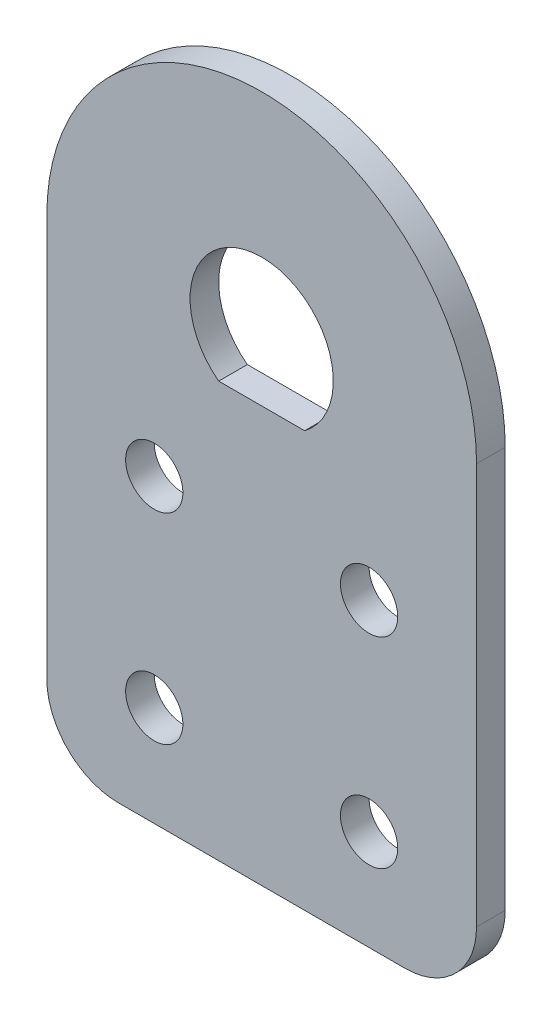
ISO-10303-21;
HEADER;
FILE_DESCRIPTION(('STEP AP214'),'2;1');
FILE_NAME('part.step','',(''),(''),'','','');
FILE_SCHEMA(('AUTOMOTIVE_DESIGN { 1 0 10303 214 1 1 1 1 }'));
ENDSEC;
DATA;
#1=APPLICATION_CONTEXT('core data for automotive mechanical design processes');
#2=APPLICATION_PROTOCOL_DEFINITION('international standard','automotive_design',2000,#1);
#3=PRODUCT_CONTEXT('',#1,'mechanical');
#4=PRODUCT('Part','Part','',(#3));
#5=PRODUCT_RELATED_PRODUCT_CATEGORY('part','',(#4));
#6=PRODUCT_DEFINITION_FORMATION('','',#4);
#7=PRODUCT_DEFINITION_CONTEXT('part definition',#1,'design');
#8=PRODUCT_DEFINITION('design','',#6,#7);
#9=PRODUCT_DEFINITION_SHAPE('','',#8);
#10=(LENGTH_UNIT() NAMED_UNIT(*) SI_UNIT(.MILLI.,.METRE.));
#11=(NAMED_UNIT(*) PLANE_ANGLE_UNIT() SI_UNIT($,.RADIAN.));
#12=(NAMED_UNIT(*) SI_UNIT($,.STERADIAN.) SOLID_ANGLE_UNIT());
#13=UNCERTAINTY_MEASURE_WITH_UNIT(LENGTH_MEASURE(1.E-05),#10,'distance_accuracy_value','');
#14=(GEOMETRIC_REPRESENTATION_CONTEXT(3) GLOBAL_UNCERTAINTY_ASSIGNED_CONTEXT((#13)) GLOBAL_UNIT_ASSIGNED_CONTEXT((#10,
#11,#12)) REPRESENTATION_CONTEXT('',''));
#15=CARTESIAN_POINT('',(0.,0.,0.));
#16=DIRECTION('',(0.,0.,1.));
#17=DIRECTION('',(1.,0.,0.));
#18=AXIS2_PLACEMENT_3D('',#15,#16,#17);
#19=CARTESIAN_POINT('',(0.,18.8034726819213,2.));
#20=DIRECTION('',(0.,0.,1.));
#21=DIRECTION('',(1.,0.,0.));
#22=AXIS2_PLACEMENT_3D('',#19,#20,#21);
#23=PLANE('',#22);
#24=CARTESIAN_POINT('',(7.5,-7.19652731807872,2.));
#25=DIRECTION('',(0.,0.,1.));
#26=DIRECTION('',(-1.,0.,0.));
#27=AXIS2_PLACEMENT_3D('',#24,#25,#26);
#28=CIRCLE('',#27,2.);
#29=CARTESIAN_POINT('',(5.5,-7.19652731807872,2.));
#30=VERTEX_POINT('',#29);
#31=EDGE_CURVE('E146',#30,#30,#28,.T.);
#32=ORIENTED_EDGE('',*,*,#31,.F.);
#33=EDGE_LOOP('',(#32));
#34=FACE_BOUND('',#33,.T.);
#35=CARTESIAN_POINT('',(-7.5,6.80347268192128,2.));
#36=DIRECTION('',(0.,0.,1.));
#37=DIRECTION('',(1.,0.,0.));
#38=AXIS2_PLACEMENT_3D('',#35,#36,#37);
#39=CIRCLE('',#38,2.);
#40=CARTESIAN_POINT('',(-5.5,6.80347268192128,2.));
#41=VERTEX_POINT('',#40);
#42=EDGE_CURVE('E162',#41,#41,#39,.T.);
#43=ORIENTED_EDGE('',*,*,#42,.F.);
#44=EDGE_LOOP('',(#43));
#45=FACE_BOUND('',#44,.T.);
#46=DIRECTION('',(1.,0.,0.));
#47=VECTOR('',#46,1.);
#48=CARTESIAN_POINT('',(15.,-14.1965273180787,2.));
#49=LINE('',#48,#47);
#50=CARTESIAN_POINT('',(-9.99999999999999,-14.1965273180787,2.));
#51=VERTEX_POINT('',#50);
#52=CARTESIAN_POINT('',(10.,-14.1965273180787,2.));
#53=VERTEX_POINT('',#52);
#54=EDGE_CURVE('E178',#51,#53,#49,.T.);
#55=ORIENTED_EDGE('',*,*,#54,.T.);
#56=CARTESIAN_POINT('',(10.,-9.19652731807872,2.));
#57=DIRECTION('',(0.,0.,1.));
#58=DIRECTION('',(1.,0.,0.));
#59=AXIS2_PLACEMENT_3D('',#56,#57,#58);
#60=CIRCLE('',#59,5.);
#61=CARTESIAN_POINT('',(15.,-9.19652731807872,2.));
#62=VERTEX_POINT('',#61);
#63=EDGE_CURVE('E50',#53,#62,#60,.T.);
#64=ORIENTED_EDGE('',*,*,#63,.T.);
#65=DIRECTION('',(0.,1.,0.));
#66=VECTOR('',#65,1.);
#67=CARTESIAN_POINT('',(15.,18.8034726819213,2.));
#68=LINE('',#67,#66);
#69=CARTESIAN_POINT('',(15.,18.8034726819213,2.));
#70=VERTEX_POINT('',#69);
#71=EDGE_CURVE('E181',#62,#70,#68,.T.);
#72=ORIENTED_EDGE('',*,*,#71,.T.);
#73=CARTESIAN_POINT('',(0.,18.8034726819213,2.));
#74=DIRECTION('',(0.,0.,1.));
#75=DIRECTION('',(1.,0.,0.));
#76=AXIS2_PLACEMENT_3D('',#73,#74,#75);
#77=CIRCLE('',#76,15.);
#78=CARTESIAN_POINT('',(-15.,18.8034726819213,2.));
#79=VERTEX_POINT('',#78);
#80=EDGE_CURVE('E170',#70,#79,#77,.T.);
#81=ORIENTED_EDGE('',*,*,#80,.T.);
#82=DIRECTION('',(0.,-1.,0.));
#83=VECTOR('',#82,1.);
#84=CARTESIAN_POINT('',(-15.,-14.1965273180787,2.));
#85=LINE('',#84,#83);
#86=CARTESIAN_POINT('',(-15.,-9.19652731807872,2.));
#87=VERTEX_POINT('',#86);
#88=EDGE_CURVE('E174',#79,#87,#85,.T.);
#89=ORIENTED_EDGE('',*,*,#88,.T.);
#90=CARTESIAN_POINT('',(-10.,-9.19652731807872,2.));
#91=DIRECTION('',(0.,0.,1.));
#92=DIRECTION('',(1.,0.,0.));
#93=AXIS2_PLACEMENT_3D('',#90,#91,#92);
#94=CIRCLE('',#93,5.);
#95=EDGE_CURVE('E219',#87,#51,#94,.T.);
#96=ORIENTED_EDGE('',*,*,#95,.T.);
#97=EDGE_LOOP('',(#55,#64,#72,#81,#89,#96));
#98=FACE_BOUND('',#97,.T.);
#99=CARTESIAN_POINT('',(-7.5,-7.19652731807872,2.));
#100=DIRECTION('',(0.,0.,1.));
#101=DIRECTION('',(1.,0.,0.));
#102=AXIS2_PLACEMENT_3D('',#99,#100,#101);
#103=CIRCLE('',#102,2.);
#104=CARTESIAN_POINT('',(-5.5,-7.19652731807872,2.));
#105=VERTEX_POINT('',#104);
#106=EDGE_CURVE('E154',#105,#105,#103,.T.);
#107=ORIENTED_EDGE('',*,*,#106,.F.);
#108=EDGE_LOOP('',(#107));
#109=FACE_BOUND('',#108,.T.);
#110=CARTESIAN_POINT('',(7.5,6.80347268192128,2.));
#111=DIRECTION('',(0.,0.,1.));
#112=DIRECTION('',(-1.,0.,0.));
#113=AXIS2_PLACEMENT_3D('',#110,#111,#112);
#114=CIRCLE('',#113,2.);
#115=CARTESIAN_POINT('',(5.5,6.80347268192128,2.));
#116=VERTEX_POINT('',#115);
#117=EDGE_CURVE('E138',#116,#116,#114,.T.);
#118=ORIENTED_EDGE('',*,*,#117,.F.);
#119=EDGE_LOOP('',(#118));
#120=FACE_BOUND('',#119,.T.);
#121=DIRECTION('',(1.,0.,0.));
#122=VECTOR('',#121,1.);
#123=CARTESIAN_POINT('',(-3.,14.8034726819213,2.));
#124=LINE('',#123,#122);
#125=CARTESIAN_POINT('',(-3.,14.8034726819213,2.));
#126=VERTEX_POINT('',#125);
#127=CARTESIAN_POINT('',(3.,14.8034726819213,2.));
#128=VERTEX_POINT('',#127);
#129=EDGE_CURVE('E108',#126,#128,#124,.T.);
#130=ORIENTED_EDGE('',*,*,#129,.F.);
#131=CARTESIAN_POINT('',(0.,18.8034726819213,2.));
#132=DIRECTION('',(0.,0.,1.));
#133=DIRECTION('',(1.,0.,0.));
#134=AXIS2_PLACEMENT_3D('',#131,#132,#133);
#135=CIRCLE('',#134,5.);
#136=EDGE_CURVE('E119',#128,#126,#135,.T.);
#137=ORIENTED_EDGE('',*,*,#136,.F.);
#138=EDGE_LOOP('',(#130,#137));
#139=FACE_BOUND('',#138,.T.);
#140=ADVANCED_FACE('F41',(#34,#45,#98,#109,#120,#139),#23,.T.);
#141=CARTESIAN_POINT('',(0.,18.8034726819213,0.));
#142=DIRECTION('',(0.,0.,1.));
#143=DIRECTION('',(1.,0.,0.));
#144=AXIS2_PLACEMENT_3D('',#141,#142,#143);
#145=PLANE('',#144);
#146=CARTESIAN_POINT('',(7.5,6.80347268192128,0.));
#147=DIRECTION('',(0.,0.,1.));
#148=DIRECTION('',(-1.,0.,0.));
#149=AXIS2_PLACEMENT_3D('',#146,#147,#148);
#150=CIRCLE('',#149,2.);
#151=CARTESIAN_POINT('',(5.5,6.80347268192128,0.));
#152=VERTEX_POINT('',#151);
#153=EDGE_CURVE('E137',#152,#152,#150,.T.);
#154=ORIENTED_EDGE('',*,*,#153,.T.);
#155=EDGE_LOOP('',(#154));
#156=FACE_BOUND('',#155,.T.);
#157=CARTESIAN_POINT('',(7.5,-7.19652731807872,0.));
#158=DIRECTION('',(0.,0.,1.));
#159=DIRECTION('',(-1.,0.,0.));
#160=AXIS2_PLACEMENT_3D('',#157,#158,#159);
#161=CIRCLE('',#160,2.);
#162=CARTESIAN_POINT('',(5.5,-7.19652731807872,0.));
#163=VERTEX_POINT('',#162);
#164=EDGE_CURVE('E142',#163,#163,#161,.T.);
#165=ORIENTED_EDGE('',*,*,#164,.T.);
#166=EDGE_LOOP('',(#165));
#167=FACE_BOUND('',#166,.T.);
#168=CARTESIAN_POINT('',(-7.5,-7.19652731807872,0.));
#169=DIRECTION('',(0.,0.,1.));
#170=DIRECTION('',(1.,0.,0.));
#171=AXIS2_PLACEMENT_3D('',#168,#169,#170);
#172=CIRCLE('',#171,2.);
#173=CARTESIAN_POINT('',(-5.5,-7.19652731807872,0.));
#174=VERTEX_POINT('',#173);
#175=EDGE_CURVE('E150',#174,#174,#172,.T.);
#176=ORIENTED_EDGE('',*,*,#175,.T.);
#177=EDGE_LOOP('',(#176));
#178=FACE_BOUND('',#177,.T.);
#179=CARTESIAN_POINT('',(-7.5,6.80347268192128,0.));
#180=DIRECTION('',(0.,0.,1.));
#181=DIRECTION('',(1.,0.,0.));
#182=AXIS2_PLACEMENT_3D('',#179,#180,#181);
#183=CIRCLE('',#182,2.);
#184=CARTESIAN_POINT('',(-5.5,6.80347268192128,0.));
#185=VERTEX_POINT('',#184);
#186=EDGE_CURVE('E158',#185,#185,#183,.T.);
#187=ORIENTED_EDGE('',*,*,#186,.T.);
#188=EDGE_LOOP('',(#187));
#189=FACE_BOUND('',#188,.T.);
#190=DIRECTION('',(0.,1.,0.));
#191=VECTOR('',#190,1.);
#192=CARTESIAN_POINT('',(15.,18.8034726819213,0.));
#193=LINE('',#192,#191);
#194=CARTESIAN_POINT('',(15.,-9.19652731807872,0.));
#195=VERTEX_POINT('',#194);
#196=CARTESIAN_POINT('',(15.,18.8034726819213,0.));
#197=VERTEX_POINT('',#196);
#198=EDGE_CURVE('E175',#195,#197,#193,.T.);
#199=ORIENTED_EDGE('',*,*,#198,.F.);
#200=CARTESIAN_POINT('',(10.,-9.19652731807872,0.));
#201=DIRECTION('',(0.,0.,1.));
#202=DIRECTION('',(1.,0.,0.));
#203=AXIS2_PLACEMENT_3D('',#200,#201,#202);
#204=CIRCLE('',#203,5.);
#205=CARTESIAN_POINT('',(10.,-14.1965273180787,0.));
#206=VERTEX_POINT('',#205);
#207=EDGE_CURVE('E210',#195,#206,#204,.F.);
#208=ORIENTED_EDGE('',*,*,#207,.T.);
#209=DIRECTION('',(1.,0.,0.));
#210=VECTOR('',#209,1.);
#211=CARTESIAN_POINT('',(15.,-14.1965273180787,0.));
#212=LINE('',#211,#210);
#213=CARTESIAN_POINT('',(-9.99999999999999,-14.1965273180787,0.));
#214=VERTEX_POINT('',#213);
#215=EDGE_CURVE('E191',#214,#206,#212,.T.);
#216=ORIENTED_EDGE('',*,*,#215,.F.);
#217=CARTESIAN_POINT('',(-10.,-9.19652731807872,0.));
#218=DIRECTION('',(0.,0.,1.));
#219=DIRECTION('',(1.,0.,0.));
#220=AXIS2_PLACEMENT_3D('',#217,#218,#219);
#221=CIRCLE('',#220,5.);
#222=CARTESIAN_POINT('',(-15.,-9.19652731807872,0.));
#223=VERTEX_POINT('',#222);
#224=EDGE_CURVE('E207',#214,#223,#221,.F.);
#225=ORIENTED_EDGE('',*,*,#224,.T.);
#226=DIRECTION('',(0.,-1.,0.));
#227=VECTOR('',#226,1.);
#228=CARTESIAN_POINT('',(-15.,-14.1965273180787,0.));
#229=LINE('',#228,#227);
#230=CARTESIAN_POINT('',(-15.,18.8034726819213,0.));
#231=VERTEX_POINT('',#230);
#232=EDGE_CURVE('E188',#231,#223,#229,.T.);
#233=ORIENTED_EDGE('',*,*,#232,.F.);
#234=CARTESIAN_POINT('',(0.,18.8034726819213,0.));
#235=DIRECTION('',(0.,0.,1.));
#236=DIRECTION('',(1.,0.,0.));
#237=AXIS2_PLACEMENT_3D('',#234,#235,#236);
#238=CIRCLE('',#237,15.);
#239=EDGE_CURVE('E166',#197,#231,#238,.T.);
#240=ORIENTED_EDGE('',*,*,#239,.F.);
#241=EDGE_LOOP('',(#199,#208,#216,#225,#233,#240));
#242=FACE_BOUND('',#241,.T.);
#243=CARTESIAN_POINT('',(0.,18.8034726819213,0.));
#244=DIRECTION('',(0.,0.,1.));
#245=DIRECTION('',(1.,0.,0.));
#246=AXIS2_PLACEMENT_3D('',#243,#244,#245);
#247=CIRCLE('',#246,5.);
#248=CARTESIAN_POINT('',(3.,14.8034726819213,0.));
#249=VERTEX_POINT('',#248);
#250=CARTESIAN_POINT('',(-3.,14.8034726819213,0.));
#251=VERTEX_POINT('',#250);
#252=EDGE_CURVE('E124',#249,#251,#247,.T.);
#253=ORIENTED_EDGE('',*,*,#252,.T.);
#254=DIRECTION('',(1.,0.,0.));
#255=VECTOR('',#254,1.);
#256=CARTESIAN_POINT('',(-3.,14.8034726819213,0.));
#257=LINE('',#256,#255);
#258=EDGE_CURVE('E128',#251,#249,#257,.T.);
#259=ORIENTED_EDGE('',*,*,#258,.T.);
#260=EDGE_LOOP('',(#253,#259));
#261=FACE_BOUND('',#260,.T.);
#262=ADVANCED_FACE('F236',(#156,#167,#178,#189,#242,#261),#145,.F.);
#263=CARTESIAN_POINT('',(0.,18.8034726819213,2.));
#264=DIRECTION('',(0.,0.,-1.));
#265=DIRECTION('',(-1.,0.,0.));
#266=AXIS2_PLACEMENT_3D('',#263,#264,#265);
#267=CYLINDRICAL_SURFACE('',#266,15.);
#268=ORIENTED_EDGE('',*,*,#239,.T.);
#269=DIRECTION('',(0.,0.,-1.));
#270=VECTOR('',#269,1.);
#271=CARTESIAN_POINT('',(-15.,18.8034726819213,2.));
#272=LINE('',#271,#270);
#273=EDGE_CURVE('E199',#79,#231,#272,.T.);
#274=ORIENTED_EDGE('',*,*,#273,.F.);
#275=ORIENTED_EDGE('',*,*,#80,.F.);
#276=DIRECTION('',(0.,0.,-1.));
#277=VECTOR('',#276,1.);
#278=CARTESIAN_POINT('',(15.,18.8034726819213,2.));
#279=LINE('',#278,#277);
#280=EDGE_CURVE('E184',#70,#197,#279,.T.);
#281=ORIENTED_EDGE('',*,*,#280,.T.);
#282=EDGE_LOOP('',(#268,#274,#275,#281));
#283=FACE_BOUND('',#282,.T.);
#284=ADVANCED_FACE('F246',(#283),#267,.T.);
#285=CARTESIAN_POINT('',(-15.,-14.1965273180787,2.));
#286=DIRECTION('',(1.,0.,0.));
#287=DIRECTION('',(0.,1.,0.));
#288=AXIS2_PLACEMENT_3D('',#285,#286,#287);
#289=PLANE('',#288);
#290=ORIENTED_EDGE('',*,*,#232,.T.);
#291=DIRECTION('',(0.,0.,-1.));
#292=VECTOR('',#291,1.);
#293=CARTESIAN_POINT('',(-15.,-9.19652731807872,2.));
#294=LINE('',#293,#292);
#295=EDGE_CURVE('E11',#223,#87,#294,.F.);
#296=ORIENTED_EDGE('',*,*,#295,.T.);
#297=ORIENTED_EDGE('',*,*,#88,.F.);
#298=ORIENTED_EDGE('',*,*,#273,.T.);
#299=EDGE_LOOP('',(#290,#296,#297,#298));
#300=FACE_BOUND('',#299,.T.);
#301=ADVANCED_FACE('F243',(#300),#289,.F.);
#302=CARTESIAN_POINT('',(15.,-14.1965273180787,2.));
#303=DIRECTION('',(0.,1.,0.));
#304=DIRECTION('',(0.,0.,1.));
#305=AXIS2_PLACEMENT_3D('',#302,#303,#304);
#306=PLANE('',#305);
#307=ORIENTED_EDGE('',*,*,#215,.T.);
#308=DIRECTION('',(0.,0.,-1.));
#309=VECTOR('',#308,1.);
#310=CARTESIAN_POINT('',(10.,-14.1965273180787,2.));
#311=LINE('',#310,#309);
#312=EDGE_CURVE('E63',#206,#53,#311,.F.);
#313=ORIENTED_EDGE('',*,*,#312,.T.);
#314=ORIENTED_EDGE('',*,*,#54,.F.);
#315=DIRECTION('',(0.,0.,-1.));
#316=VECTOR('',#315,1.);
#317=CARTESIAN_POINT('',(-10.,-14.1965273180787,2.));
#318=LINE('',#317,#316);
#319=EDGE_CURVE('E213',#51,#214,#318,.T.);
#320=ORIENTED_EDGE('',*,*,#319,.T.);
#321=EDGE_LOOP('',(#307,#313,#314,#320));
#322=FACE_BOUND('',#321,.T.);
#323=ADVANCED_FACE('F239',(#322),#306,.F.);
#324=CARTESIAN_POINT('',(15.,18.8034726819213,2.));
#325=DIRECTION('',(-1.,0.,0.));
#326=DIRECTION('',(0.,-1.,0.));
#327=AXIS2_PLACEMENT_3D('',#324,#325,#326);
#328=PLANE('',#327);
#329=ORIENTED_EDGE('',*,*,#71,.F.);
#330=DIRECTION('',(0.,0.,-1.));
#331=VECTOR('',#330,1.);
#332=CARTESIAN_POINT('',(15.,-9.19652731807872,2.));
#333=LINE('',#332,#331);
#334=EDGE_CURVE('E203',#62,#195,#333,.T.);
#335=ORIENTED_EDGE('',*,*,#334,.T.);
#336=ORIENTED_EDGE('',*,*,#198,.T.);
#337=ORIENTED_EDGE('',*,*,#280,.F.);
#338=EDGE_LOOP('',(#329,#335,#336,#337));
#339=FACE_BOUND('',#338,.T.);
#340=ADVANCED_FACE('F230',(#339),#328,.F.);
#341=CARTESIAN_POINT('',(-7.5,6.80347268192128,2.));
#342=DIRECTION('',(0.,0.,-1.));
#343=DIRECTION('',(-1.,0.,0.));
#344=AXIS2_PLACEMENT_3D('',#341,#342,#343);
#345=CYLINDRICAL_SURFACE('',#344,2.);
#346=ORIENTED_EDGE('',*,*,#42,.T.);
#347=EDGE_LOOP('',(#346));
#348=FACE_BOUND('',#347,.T.);
#349=ORIENTED_EDGE('',*,*,#186,.F.);
#350=EDGE_LOOP('',(#349));
#351=FACE_BOUND('',#350,.T.);
#352=ADVANCED_FACE('F264',(#348,#351),#345,.F.);
#353=CARTESIAN_POINT('',(-7.5,-7.19652731807872,2.));
#354=DIRECTION('',(0.,0.,-1.));
#355=DIRECTION('',(-1.,0.,0.));
#356=AXIS2_PLACEMENT_3D('',#353,#354,#355);
#357=CYLINDRICAL_SURFACE('',#356,2.);
#358=ORIENTED_EDGE('',*,*,#106,.T.);
#359=EDGE_LOOP('',(#358));
#360=FACE_BOUND('',#359,.T.);
#361=ORIENTED_EDGE('',*,*,#175,.F.);
#362=EDGE_LOOP('',(#361));
#363=FACE_BOUND('',#362,.T.);
#364=ADVANCED_FACE('F285',(#360,#363),#357,.F.);
#365=CARTESIAN_POINT('',(7.5,-7.19652731807872,2.));
#366=DIRECTION('',(0.,0.,-1.));
#367=DIRECTION('',(-1.,0.,0.));
#368=AXIS2_PLACEMENT_3D('',#365,#366,#367);
#369=CYLINDRICAL_SURFACE('',#368,2.);
#370=ORIENTED_EDGE('',*,*,#31,.T.);
#371=EDGE_LOOP('',(#370));
#372=FACE_BOUND('',#371,.T.);
#373=ORIENTED_EDGE('',*,*,#164,.F.);
#374=EDGE_LOOP('',(#373));
#375=FACE_BOUND('',#374,.T.);
#376=ADVANCED_FACE('F292',(#372,#375),#369,.F.);
#377=CARTESIAN_POINT('',(7.5,6.80347268192128,2.));
#378=DIRECTION('',(0.,0.,-1.));
#379=DIRECTION('',(-1.,0.,0.));
#380=AXIS2_PLACEMENT_3D('',#377,#378,#379);
#381=CYLINDRICAL_SURFACE('',#380,2.);
#382=ORIENTED_EDGE('',*,*,#117,.T.);
#383=EDGE_LOOP('',(#382));
#384=FACE_BOUND('',#383,.T.);
#385=ORIENTED_EDGE('',*,*,#153,.F.);
#386=EDGE_LOOP('',(#385));
#387=FACE_BOUND('',#386,.T.);
#388=ADVANCED_FACE('F299',(#384,#387),#381,.F.);
#389=CARTESIAN_POINT('',(0.,18.8034726819213,2.));
#390=DIRECTION('',(0.,0.,-1.));
#391=DIRECTION('',(-1.,0.,0.));
#392=AXIS2_PLACEMENT_3D('',#389,#390,#391);
#393=CYLINDRICAL_SURFACE('',#392,5.);
#394=ORIENTED_EDGE('',*,*,#252,.F.);
#395=DIRECTION('',(0.,0.,-1.));
#396=VECTOR('',#395,1.);
#397=CARTESIAN_POINT('',(3.,14.8034726819213,2.));
#398=LINE('',#397,#396);
#399=EDGE_CURVE('E111',#128,#249,#398,.T.);
#400=ORIENTED_EDGE('',*,*,#399,.F.);
#401=ORIENTED_EDGE('',*,*,#136,.T.);
#402=DIRECTION('',(0.,0.,-1.));
#403=VECTOR('',#402,1.);
#404=CARTESIAN_POINT('',(-3.,14.8034726819213,2.));
#405=LINE('',#404,#403);
#406=EDGE_CURVE('E114',#126,#251,#405,.T.);
#407=ORIENTED_EDGE('',*,*,#406,.T.);
#408=EDGE_LOOP('',(#394,#400,#401,#407));
#409=FACE_BOUND('',#408,.T.);
#410=ADVANCED_FACE('F122',(#409),#393,.F.);
#411=CARTESIAN_POINT('',(-3.,14.8034726819213,2.));
#412=DIRECTION('',(0.,1.,0.));
#413=DIRECTION('',(0.,0.,1.));
#414=AXIS2_PLACEMENT_3D('',#411,#412,#413);
#415=PLANE('',#414);
#416=ORIENTED_EDGE('',*,*,#258,.F.);
#417=ORIENTED_EDGE('',*,*,#406,.F.);
#418=ORIENTED_EDGE('',*,*,#129,.T.);
#419=ORIENTED_EDGE('',*,*,#399,.T.);
#420=EDGE_LOOP('',(#416,#417,#418,#419));
#421=FACE_BOUND('',#420,.T.);
#422=ADVANCED_FACE('F110',(#421),#415,.T.);
#423=CARTESIAN_POINT('',(10.,-9.19652731807872,2.));
#424=DIRECTION('',(0.,0.,-1.));
#425=DIRECTION('',(-1.,0.,0.));
#426=AXIS2_PLACEMENT_3D('',#423,#424,#425);
#427=CYLINDRICAL_SURFACE('',#426,5.);
#428=ORIENTED_EDGE('',*,*,#63,.F.);
#429=ORIENTED_EDGE('',*,*,#312,.F.);
#430=ORIENTED_EDGE('',*,*,#207,.F.);
#431=ORIENTED_EDGE('',*,*,#334,.F.);
#432=EDGE_LOOP('',(#428,#429,#430,#431));
#433=FACE_BOUND('',#432,.T.);
#434=ADVANCED_FACE('F233',(#433),#427,.T.);
#435=CARTESIAN_POINT('',(-10.,-9.19652731807872,2.));
#436=DIRECTION('',(0.,0.,-1.));
#437=DIRECTION('',(-1.,0.,0.));
#438=AXIS2_PLACEMENT_3D('',#435,#436,#437);
#439=CYLINDRICAL_SURFACE('',#438,5.);
#440=ORIENTED_EDGE('',*,*,#95,.F.);
#441=ORIENTED_EDGE('',*,*,#295,.F.);
#442=ORIENTED_EDGE('',*,*,#224,.F.);
#443=ORIENTED_EDGE('',*,*,#319,.F.);
#444=EDGE_LOOP('',(#440,#441,#442,#443));
#445=FACE_BOUND('',#444,.T.);
#446=ADVANCED_FACE('F43',(#445),#439,.T.);
#447=CLOSED_SHELL('',(#140,#262,#284,#301,#323,#340,#352,#364,#376,#388,#410,#422,#434,#446));
#448=MANIFOLD_SOLID_BREP('B2',#447);
#449=ADVANCED_BREP_SHAPE_REPRESENTATION('',(#18,#448),#14);
#450=SHAPE_DEFINITION_REPRESENTATION(#9,#449);
ENDSEC;
END-ISO-10303-21;
